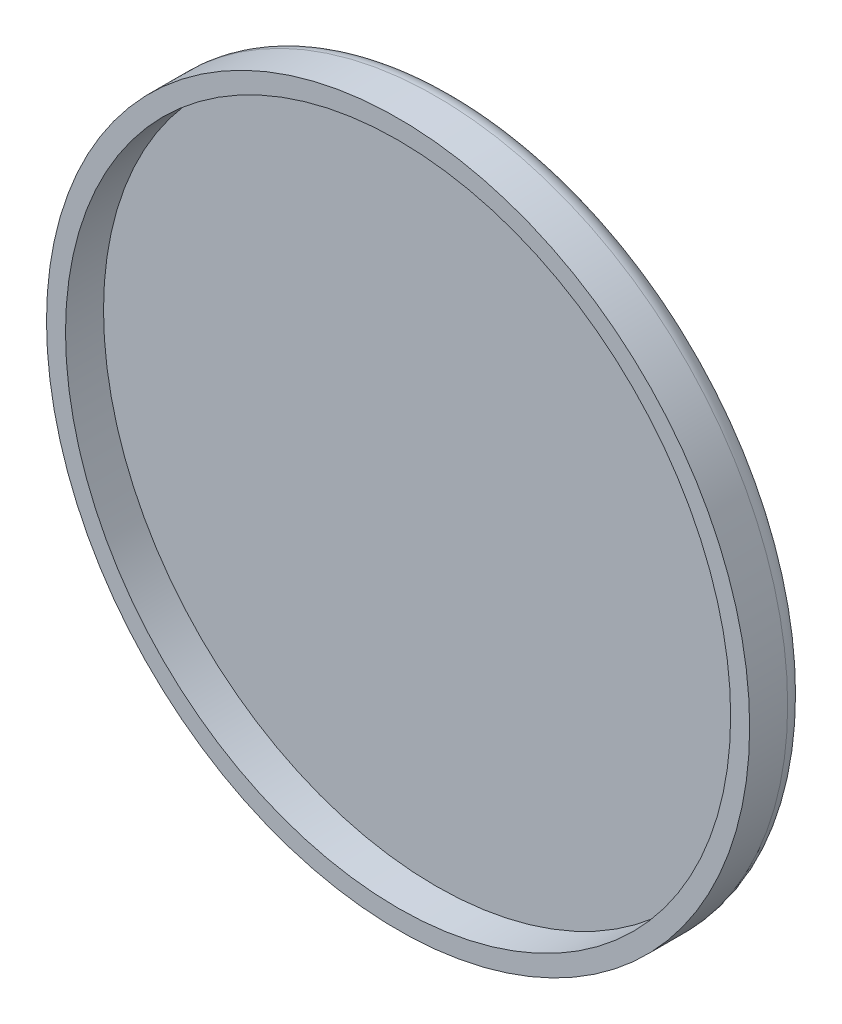
ISO-10303-21;
HEADER;
FILE_DESCRIPTION(('STEP AP214'),'2;1');
FILE_NAME('part.step','',(''),(''),'','','');
FILE_SCHEMA(('AUTOMOTIVE_DESIGN { 1 0 10303 214 1 1 1 1 }'));
ENDSEC;
DATA;
#1=APPLICATION_CONTEXT('core data for automotive mechanical design processes');
#2=APPLICATION_PROTOCOL_DEFINITION('international standard','automotive_design',2000,#1);
#3=PRODUCT_CONTEXT('',#1,'mechanical');
#4=PRODUCT('Part','Part','',(#3));
#5=PRODUCT_RELATED_PRODUCT_CATEGORY('part','',(#4));
#6=PRODUCT_DEFINITION_FORMATION('','',#4);
#7=PRODUCT_DEFINITION_CONTEXT('part definition',#1,'design');
#8=PRODUCT_DEFINITION('design','',#6,#7);
#9=PRODUCT_DEFINITION_SHAPE('','',#8);
#10=(LENGTH_UNIT() NAMED_UNIT(*) SI_UNIT(.MILLI.,.METRE.));
#11=(NAMED_UNIT(*) PLANE_ANGLE_UNIT() SI_UNIT($,.RADIAN.));
#12=(NAMED_UNIT(*) SI_UNIT($,.STERADIAN.) SOLID_ANGLE_UNIT());
#13=UNCERTAINTY_MEASURE_WITH_UNIT(LENGTH_MEASURE(1.E-05),#10,'distance_accuracy_value','');
#14=(GEOMETRIC_REPRESENTATION_CONTEXT(3) GLOBAL_UNCERTAINTY_ASSIGNED_CONTEXT((#13)) GLOBAL_UNIT_ASSIGNED_CONTEXT((#10,
#11,#12)) REPRESENTATION_CONTEXT('',''));
#15=CARTESIAN_POINT('',(0.,0.,0.));
#16=DIRECTION('',(0.,0.,1.));
#17=DIRECTION('',(1.,0.,0.));
#18=AXIS2_PLACEMENT_3D('',#15,#16,#17);
#19=CARTESIAN_POINT('',(0.,0.,6.));
#20=DIRECTION('',(0.,0.,-1.));
#21=DIRECTION('',(-1.,0.,0.));
#22=AXIS2_PLACEMENT_3D('',#19,#20,#21);
#23=CYLINDRICAL_SURFACE('',#22,37.);
#24=CARTESIAN_POINT('',(0.,0.,2.));
#25=DIRECTION('',(0.,0.,1.));
#26=DIRECTION('',(1.,0.,0.));
#27=AXIS2_PLACEMENT_3D('',#24,#25,#26);
#28=CIRCLE('',#27,37.);
#29=CARTESIAN_POINT('',(37.,0.,2.));
#30=VERTEX_POINT('',#29);
#31=EDGE_CURVE('E38',#30,#30,#28,.T.);
#32=ORIENTED_EDGE('',*,*,#31,.T.);
#33=EDGE_LOOP('',(#32));
#34=FACE_BOUND('',#33,.T.);
#35=CARTESIAN_POINT('',(0.,0.,6.));
#36=DIRECTION('',(0.,0.,1.));
#37=DIRECTION('',(1.,0.,0.));
#38=AXIS2_PLACEMENT_3D('',#35,#36,#37);
#39=CIRCLE('',#38,37.);
#40=CARTESIAN_POINT('',(37.,0.,6.));
#41=VERTEX_POINT('',#40);
#42=EDGE_CURVE('E42',#41,#41,#39,.T.);
#43=ORIENTED_EDGE('',*,*,#42,.F.);
#44=EDGE_LOOP('',(#43));
#45=FACE_BOUND('',#44,.T.);
#46=ADVANCED_FACE('F31',(#34,#45),#23,.T.);
#47=CARTESIAN_POINT('',(0.,0.,6.));
#48=DIRECTION('',(0.,0.,1.));
#49=DIRECTION('',(1.,0.,0.));
#50=AXIS2_PLACEMENT_3D('',#47,#48,#49);
#51=PLANE('',#50);
#52=CARTESIAN_POINT('',(0.,0.,6.));
#53=DIRECTION('',(0.,0.,1.));
#54=DIRECTION('',(1.,0.,0.));
#55=AXIS2_PLACEMENT_3D('',#52,#53,#54);
#56=CIRCLE('',#55,35.);
#57=CARTESIAN_POINT('',(35.,0.,6.));
#58=VERTEX_POINT('',#57);
#59=EDGE_CURVE('E49',#58,#58,#56,.T.);
#60=ORIENTED_EDGE('',*,*,#59,.F.);
#61=EDGE_LOOP('',(#60));
#62=FACE_BOUND('',#61,.T.);
#63=ORIENTED_EDGE('',*,*,#42,.T.);
#64=EDGE_LOOP('',(#63));
#65=FACE_BOUND('',#64,.T.);
#66=ADVANCED_FACE('F64',(#62,#65),#51,.T.);
#67=CARTESIAN_POINT('',(0.,0.,0.));
#68=DIRECTION('',(0.,0.,1.));
#69=DIRECTION('',(1.,0.,0.));
#70=AXIS2_PLACEMENT_3D('',#67,#68,#69);
#71=PLANE('',#70);
#72=CARTESIAN_POINT('',(0.,0.,0.));
#73=DIRECTION('',(0.,0.,1.));
#74=DIRECTION('',(1.,0.,0.));
#75=AXIS2_PLACEMENT_3D('',#72,#73,#74);
#76=CIRCLE('',#75,35.);
#77=CARTESIAN_POINT('',(35.,0.,0.));
#78=VERTEX_POINT('',#77);
#79=EDGE_CURVE('E10',#78,#78,#76,.F.);
#80=ORIENTED_EDGE('',*,*,#79,.T.);
#81=EDGE_LOOP('',(#80));
#82=FACE_BOUND('',#81,.T.);
#83=ADVANCED_FACE('F60',(#82),#71,.F.);
#84=CARTESIAN_POINT('',(0.,0.,2.));
#85=DIRECTION('',(0.,0.,1.));
#86=DIRECTION('',(1.,0.,0.));
#87=AXIS2_PLACEMENT_3D('',#84,#85,#86);
#88=CYLINDRICAL_SURFACE('',#87,35.);
#89=CARTESIAN_POINT('',(0.,0.,2.));
#90=DIRECTION('',(0.,0.,1.));
#91=DIRECTION('',(1.,0.,0.));
#92=AXIS2_PLACEMENT_3D('',#89,#90,#91);
#93=CIRCLE('',#92,35.);
#94=CARTESIAN_POINT('',(35.,0.,2.));
#95=VERTEX_POINT('',#94);
#96=EDGE_CURVE('E46',#95,#95,#93,.T.);
#97=ORIENTED_EDGE('',*,*,#96,.F.);
#98=EDGE_LOOP('',(#97));
#99=FACE_BOUND('',#98,.T.);
#100=ORIENTED_EDGE('',*,*,#59,.T.);
#101=EDGE_LOOP('',(#100));
#102=FACE_BOUND('',#101,.T.);
#103=ADVANCED_FACE('F57',(#99,#102),#88,.F.);
#104=CARTESIAN_POINT('',(0.,0.,2.));
#105=DIRECTION('',(0.,0.,1.));
#106=DIRECTION('',(1.,0.,0.));
#107=AXIS2_PLACEMENT_3D('',#104,#105,#106);
#108=PLANE('',#107);
#109=ORIENTED_EDGE('',*,*,#96,.T.);
#110=EDGE_LOOP('',(#109));
#111=FACE_BOUND('',#110,.T.);
#112=ADVANCED_FACE('F55',(#111),#108,.T.);
#113=CARTESIAN_POINT('',(0.,0.,2.));
#114=DIRECTION('',(0.,0.,1.));
#115=DIRECTION('',(1.,0.,0.));
#116=AXIS2_PLACEMENT_3D('',#113,#114,#115);
#117=TOROIDAL_SURFACE('',#116,35.,2.);
#118=ORIENTED_EDGE('',*,*,#79,.F.);
#119=EDGE_LOOP('',(#118));
#120=FACE_BOUND('',#119,.T.);
#121=ORIENTED_EDGE('',*,*,#31,.F.);
#122=EDGE_LOOP('',(#121));
#123=FACE_BOUND('',#122,.T.);
#124=ADVANCED_FACE('F33',(#120,#123),#117,.T.);
#125=CLOSED_SHELL('',(#46,#66,#83,#103,#112,#124));
#126=MANIFOLD_SOLID_BREP('B2',#125);
#127=ADVANCED_BREP_SHAPE_REPRESENTATION('',(#18,#126),#14);
#128=SHAPE_DEFINITION_REPRESENTATION(#9,#127);
ENDSEC;
END-ISO-10303-21;
